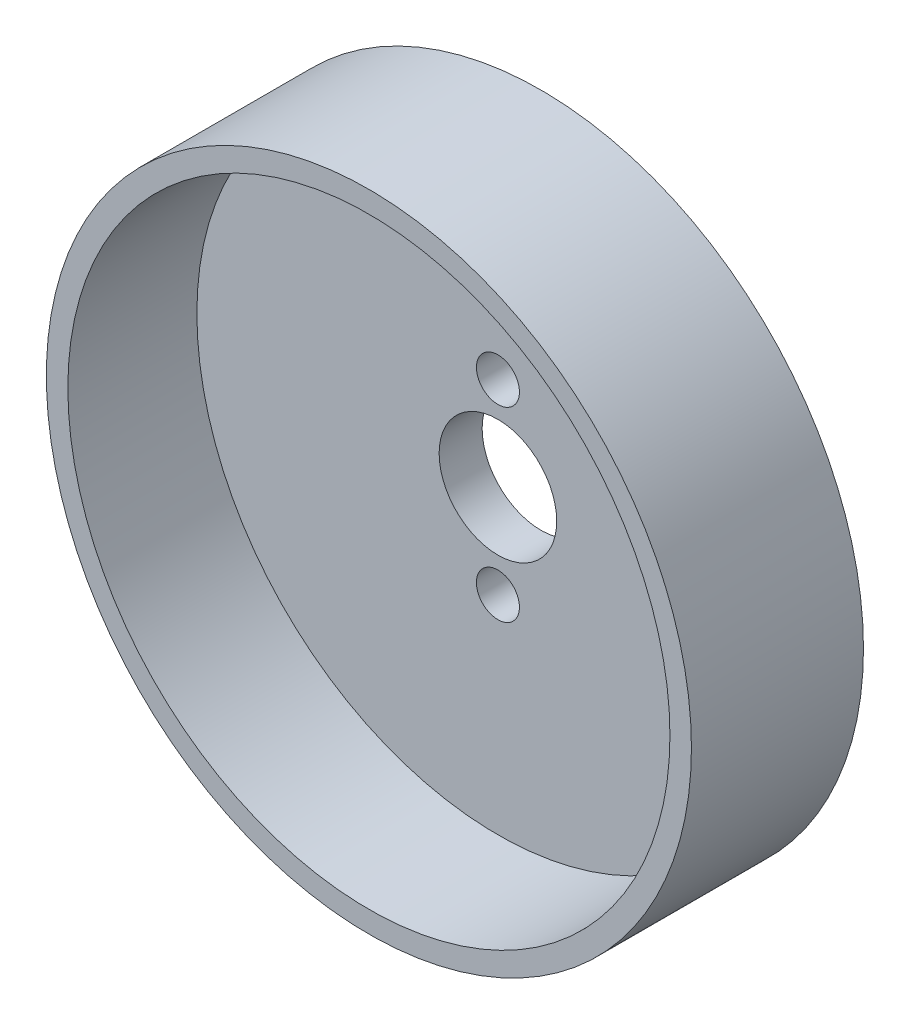
ISO-10303-21;
HEADER;
FILE_DESCRIPTION(('STEP AP214'),'2;1');
FILE_NAME('part.step','',(''),(''),'','','');
FILE_SCHEMA(('AUTOMOTIVE_DESIGN { 1 0 10303 214 1 1 1 1 }'));
ENDSEC;
DATA;
#1=APPLICATION_CONTEXT('core data for automotive mechanical design processes');
#2=APPLICATION_PROTOCOL_DEFINITION('international standard','automotive_design',2000,#1);
#3=PRODUCT_CONTEXT('',#1,'mechanical');
#4=PRODUCT('Part','Part','',(#3));
#5=PRODUCT_RELATED_PRODUCT_CATEGORY('part','',(#4));
#6=PRODUCT_DEFINITION_FORMATION('','',#4);
#7=PRODUCT_DEFINITION_CONTEXT('part definition',#1,'design');
#8=PRODUCT_DEFINITION('design','',#6,#7);
#9=PRODUCT_DEFINITION_SHAPE('','',#8);
#10=(LENGTH_UNIT() NAMED_UNIT(*) SI_UNIT(.MILLI.,.METRE.));
#11=(NAMED_UNIT(*) PLANE_ANGLE_UNIT() SI_UNIT($,.RADIAN.));
#12=(NAMED_UNIT(*) SI_UNIT($,.STERADIAN.) SOLID_ANGLE_UNIT());
#13=UNCERTAINTY_MEASURE_WITH_UNIT(LENGTH_MEASURE(1.E-05),#10,'distance_accuracy_value','');
#14=(GEOMETRIC_REPRESENTATION_CONTEXT(3) GLOBAL_UNCERTAINTY_ASSIGNED_CONTEXT((#13)) GLOBAL_UNIT_ASSIGNED_CONTEXT((#10,
#11,#12)) REPRESENTATION_CONTEXT('',''));
#15=CARTESIAN_POINT('',(0.,0.,0.));
#16=DIRECTION('',(0.,0.,1.));
#17=DIRECTION('',(1.,0.,0.));
#18=AXIS2_PLACEMENT_3D('',#15,#16,#17);
#19=CARTESIAN_POINT('',(0.,0.,3.));
#20=DIRECTION('',(0.,0.,-1.));
#21=DIRECTION('',(-1.,0.,0.));
#22=AXIS2_PLACEMENT_3D('',#19,#20,#21);
#23=CYLINDRICAL_SURFACE('',#22,22.5);
#24=CARTESIAN_POINT('',(0.,0.,0.));
#25=DIRECTION('',(0.,0.,1.));
#26=DIRECTION('',(1.,0.,0.));
#27=AXIS2_PLACEMENT_3D('',#24,#25,#26);
#28=CIRCLE('',#27,22.5);
#29=CARTESIAN_POINT('',(22.5,0.,0.));
#30=VERTEX_POINT('',#29);
#31=EDGE_CURVE('E51',#30,#30,#28,.T.);
#32=ORIENTED_EDGE('',*,*,#31,.T.);
#33=EDGE_LOOP('',(#32));
#34=FACE_BOUND('',#33,.T.);
#35=CARTESIAN_POINT('',(0.,0.,12.));
#36=DIRECTION('',(0.,0.,1.));
#37=DIRECTION('',(1.,0.,0.));
#38=AXIS2_PLACEMENT_3D('',#35,#36,#37);
#39=CIRCLE('',#38,22.5);
#40=CARTESIAN_POINT('',(22.5,0.,12.));
#41=VERTEX_POINT('',#40);
#42=EDGE_CURVE('E57',#41,#41,#39,.T.);
#43=ORIENTED_EDGE('',*,*,#42,.F.);
#44=EDGE_LOOP('',(#43));
#45=FACE_BOUND('',#44,.T.);
#46=ADVANCED_FACE('F43',(#34,#45),#23,.T.);
#47=CARTESIAN_POINT('',(0.,0.,0.));
#48=DIRECTION('',(0.,0.,1.));
#49=DIRECTION('',(1.,0.,0.));
#50=AXIS2_PLACEMENT_3D('',#47,#48,#49);
#51=PLANE('',#50);
#52=CARTESIAN_POINT('',(0.,-6.5,0.));
#53=DIRECTION('',(0.,0.,-1.));
#54=DIRECTION('',(-1.,0.,0.));
#55=AXIS2_PLACEMENT_3D('',#52,#53,#54);
#56=CIRCLE('',#55,1.5);
#57=CARTESIAN_POINT('',(-1.5,-6.5,0.));
#58=VERTEX_POINT('',#57);
#59=EDGE_CURVE('E87',#58,#58,#56,.T.);
#60=ORIENTED_EDGE('',*,*,#59,.F.);
#61=EDGE_LOOP('',(#60));
#62=FACE_BOUND('',#61,.T.);
#63=CARTESIAN_POINT('',(0.,6.5,0.));
#64=DIRECTION('',(0.,0.,-1.));
#65=DIRECTION('',(-1.,0.,0.));
#66=AXIS2_PLACEMENT_3D('',#63,#64,#65);
#67=CIRCLE('',#66,1.5);
#68=CARTESIAN_POINT('',(-1.5,6.5,0.));
#69=VERTEX_POINT('',#68);
#70=EDGE_CURVE('E86',#69,#69,#67,.T.);
#71=ORIENTED_EDGE('',*,*,#70,.F.);
#72=EDGE_LOOP('',(#71));
#73=FACE_BOUND('',#72,.T.);
#74=CARTESIAN_POINT('',(0.,0.,0.));
#75=DIRECTION('',(0.,0.,-1.));
#76=DIRECTION('',(-1.,0.,0.));
#77=AXIS2_PLACEMENT_3D('',#74,#75,#76);
#78=CIRCLE('',#77,4.1);
#79=CARTESIAN_POINT('',(-4.1,0.,0.));
#80=VERTEX_POINT('',#79);
#81=EDGE_CURVE('E65',#80,#80,#78,.T.);
#82=ORIENTED_EDGE('',*,*,#81,.F.);
#83=EDGE_LOOP('',(#82));
#84=FACE_BOUND('',#83,.T.);
#85=ORIENTED_EDGE('',*,*,#31,.F.);
#86=EDGE_LOOP('',(#85));
#87=FACE_BOUND('',#86,.T.);
#88=ADVANCED_FACE('F97',(#62,#73,#84,#87),#51,.F.);
#89=CARTESIAN_POINT('',(0.,0.,12.));
#90=DIRECTION('',(0.,0.,1.));
#91=DIRECTION('',(1.,0.,0.));
#92=AXIS2_PLACEMENT_3D('',#89,#90,#91);
#93=PLANE('',#92);
#94=ORIENTED_EDGE('',*,*,#42,.T.);
#95=EDGE_LOOP('',(#94));
#96=FACE_BOUND('',#95,.T.);
#97=CARTESIAN_POINT('',(0.,0.,12.));
#98=DIRECTION('',(0.,0.,1.));
#99=DIRECTION('',(1.,0.,0.));
#100=AXIS2_PLACEMENT_3D('',#97,#98,#99);
#101=CIRCLE('',#100,21.);
#102=CARTESIAN_POINT('',(21.,0.,12.));
#103=VERTEX_POINT('',#102);
#104=EDGE_CURVE('E72',#103,#103,#101,.T.);
#105=ORIENTED_EDGE('',*,*,#104,.F.);
#106=EDGE_LOOP('',(#105));
#107=FACE_BOUND('',#106,.T.);
#108=ADVANCED_FACE('F100',(#96,#107),#93,.T.);
#109=CARTESIAN_POINT('',(0.,0.,12.));
#110=DIRECTION('',(0.,0.,-1.));
#111=DIRECTION('',(-1.,0.,0.));
#112=AXIS2_PLACEMENT_3D('',#109,#110,#111);
#113=CYLINDRICAL_SURFACE('',#112,21.);
#114=ORIENTED_EDGE('',*,*,#104,.T.);
#115=EDGE_LOOP('',(#114));
#116=FACE_BOUND('',#115,.T.);
#117=CARTESIAN_POINT('',(0.,0.,3.));
#118=DIRECTION('',(0.,0.,1.));
#119=DIRECTION('',(1.,0.,0.));
#120=AXIS2_PLACEMENT_3D('',#117,#118,#119);
#121=CIRCLE('',#120,21.);
#122=CARTESIAN_POINT('',(21.,0.,3.));
#123=VERTEX_POINT('',#122);
#124=EDGE_CURVE('E10',#123,#123,#121,.F.);
#125=ORIENTED_EDGE('',*,*,#124,.T.);
#126=EDGE_LOOP('',(#125));
#127=FACE_BOUND('',#126,.T.);
#128=ADVANCED_FACE('F112',(#116,#127),#113,.F.);
#129=CARTESIAN_POINT('',(0.,0.,3.));
#130=DIRECTION('',(0.,0.,1.));
#131=DIRECTION('',(1.,0.,0.));
#132=AXIS2_PLACEMENT_3D('',#129,#130,#131);
#133=PLANE('',#132);
#134=CARTESIAN_POINT('',(0.,-6.5,3.));
#135=DIRECTION('',(0.,0.,1.));
#136=DIRECTION('',(1.,0.,0.));
#137=AXIS2_PLACEMENT_3D('',#134,#135,#136);
#138=CIRCLE('',#137,1.5);
#139=CARTESIAN_POINT('',(1.5,-6.5,3.));
#140=VERTEX_POINT('',#139);
#141=EDGE_CURVE('E46',#140,#140,#138,.T.);
#142=ORIENTED_EDGE('',*,*,#141,.F.);
#143=EDGE_LOOP('',(#142));
#144=FACE_BOUND('',#143,.T.);
#145=CARTESIAN_POINT('',(0.,6.5,3.));
#146=DIRECTION('',(0.,0.,1.));
#147=DIRECTION('',(1.,0.,0.));
#148=AXIS2_PLACEMENT_3D('',#145,#146,#147);
#149=CIRCLE('',#148,1.5);
#150=CARTESIAN_POINT('',(1.5,6.5,3.));
#151=VERTEX_POINT('',#150);
#152=EDGE_CURVE('E64',#151,#151,#149,.T.);
#153=ORIENTED_EDGE('',*,*,#152,.F.);
#154=EDGE_LOOP('',(#153));
#155=FACE_BOUND('',#154,.T.);
#156=CARTESIAN_POINT('',(0.,0.,3.));
#157=DIRECTION('',(0.,0.,1.));
#158=DIRECTION('',(1.,0.,0.));
#159=AXIS2_PLACEMENT_3D('',#156,#157,#158);
#160=CIRCLE('',#159,4.1);
#161=CARTESIAN_POINT('',(4.1,0.,3.));
#162=VERTEX_POINT('',#161);
#163=EDGE_CURVE('E61',#162,#162,#160,.T.);
#164=ORIENTED_EDGE('',*,*,#163,.F.);
#165=EDGE_LOOP('',(#164));
#166=FACE_BOUND('',#165,.T.);
#167=ORIENTED_EDGE('',*,*,#124,.F.);
#168=EDGE_LOOP('',(#167));
#169=FACE_BOUND('',#168,.T.);
#170=ADVANCED_FACE('F117',(#144,#155,#166,#169),#133,.T.);
#171=CARTESIAN_POINT('',(0.,0.,12.));
#172=DIRECTION('',(0.,0.,-1.));
#173=DIRECTION('',(-1.,0.,0.));
#174=AXIS2_PLACEMENT_3D('',#171,#172,#173);
#175=CYLINDRICAL_SURFACE('',#174,4.1);
#176=ORIENTED_EDGE('',*,*,#163,.T.);
#177=EDGE_LOOP('',(#176));
#178=FACE_BOUND('',#177,.T.);
#179=ORIENTED_EDGE('',*,*,#81,.T.);
#180=EDGE_LOOP('',(#179));
#181=FACE_BOUND('',#180,.T.);
#182=ADVANCED_FACE('F122',(#178,#181),#175,.F.);
#183=CARTESIAN_POINT('',(0.,6.5,12.));
#184=DIRECTION('',(0.,0.,-1.));
#185=DIRECTION('',(-1.,0.,0.));
#186=AXIS2_PLACEMENT_3D('',#183,#184,#185);
#187=CYLINDRICAL_SURFACE('',#186,1.5);
#188=ORIENTED_EDGE('',*,*,#152,.T.);
#189=EDGE_LOOP('',(#188));
#190=FACE_BOUND('',#189,.T.);
#191=ORIENTED_EDGE('',*,*,#70,.T.);
#192=EDGE_LOOP('',(#191));
#193=FACE_BOUND('',#192,.T.);
#194=ADVANCED_FACE('F95',(#190,#193),#187,.F.);
#195=CARTESIAN_POINT('',(0.,-6.5,12.));
#196=DIRECTION('',(0.,0.,-1.));
#197=DIRECTION('',(-1.,0.,0.));
#198=AXIS2_PLACEMENT_3D('',#195,#196,#197);
#199=CYLINDRICAL_SURFACE('',#198,1.5);
#200=ORIENTED_EDGE('',*,*,#141,.T.);
#201=EDGE_LOOP('',(#200));
#202=FACE_BOUND('',#201,.T.);
#203=ORIENTED_EDGE('',*,*,#59,.T.);
#204=EDGE_LOOP('',(#203));
#205=FACE_BOUND('',#204,.T.);
#206=ADVANCED_FACE('F136',(#202,#205),#199,.F.);
#207=CLOSED_SHELL('',(#46,#88,#108,#128,#170,#182,#194,#206));
#208=MANIFOLD_SOLID_BREP('B2',#207);
#209=ADVANCED_BREP_SHAPE_REPRESENTATION('',(#18,#208),#14);
#210=SHAPE_DEFINITION_REPRESENTATION(#9,#209);
ENDSEC;
END-ISO-10303-21;
